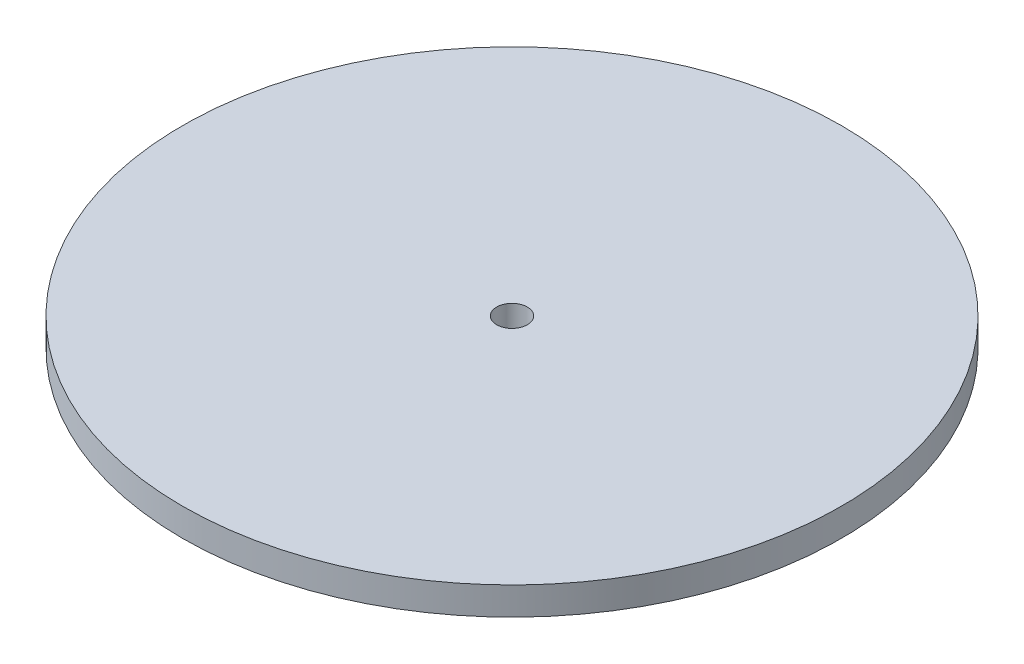
ISO-10303-21;
HEADER;
FILE_DESCRIPTION(('STEP AP214'),'2;1');
FILE_NAME('part.step','',(''),(''),'','','');
FILE_SCHEMA(('AUTOMOTIVE_DESIGN { 1 0 10303 214 1 1 1 1 }'));
ENDSEC;
DATA;
#1=APPLICATION_CONTEXT('core data for automotive mechanical design processes');
#2=APPLICATION_PROTOCOL_DEFINITION('international standard','automotive_design',2000,#1);
#3=PRODUCT_CONTEXT('',#1,'mechanical');
#4=PRODUCT('Part','Part','',(#3));
#5=PRODUCT_RELATED_PRODUCT_CATEGORY('part','',(#4));
#6=PRODUCT_DEFINITION_FORMATION('','',#4);
#7=PRODUCT_DEFINITION_CONTEXT('part definition',#1,'design');
#8=PRODUCT_DEFINITION('design','',#6,#7);
#9=PRODUCT_DEFINITION_SHAPE('','',#8);
#10=(LENGTH_UNIT() NAMED_UNIT(*) SI_UNIT(.MILLI.,.METRE.));
#11=(NAMED_UNIT(*) PLANE_ANGLE_UNIT() SI_UNIT($,.RADIAN.));
#12=(NAMED_UNIT(*) SI_UNIT($,.STERADIAN.) SOLID_ANGLE_UNIT());
#13=UNCERTAINTY_MEASURE_WITH_UNIT(LENGTH_MEASURE(1.E-05),#10,'distance_accuracy_value','');
#14=(GEOMETRIC_REPRESENTATION_CONTEXT(3) GLOBAL_UNCERTAINTY_ASSIGNED_CONTEXT((#13)) GLOBAL_UNIT_ASSIGNED_CONTEXT((#10,
#11,#12)) REPRESENTATION_CONTEXT('',''));
#15=CARTESIAN_POINT('',(0.,0.,0.));
#16=DIRECTION('',(0.,0.,1.));
#17=DIRECTION('',(1.,0.,0.));
#18=AXIS2_PLACEMENT_3D('',#15,#16,#17);
#19=CARTESIAN_POINT('',(0.,6.35,0.));
#20=DIRECTION('',(0.,-1.,0.));
#21=DIRECTION('',(0.,0.,-1.));
#22=AXIS2_PLACEMENT_3D('',#19,#20,#21);
#23=CYLINDRICAL_SURFACE('',#22,75.);
#24=CARTESIAN_POINT('',(0.,6.35,0.));
#25=DIRECTION('',(0.,1.,0.));
#26=DIRECTION('',(0.,0.,1.));
#27=AXIS2_PLACEMENT_3D('',#24,#25,#26);
#28=CIRCLE('',#27,75.);
#29=CARTESIAN_POINT('',(0.,6.35,75.));
#30=VERTEX_POINT('',#29);
#31=EDGE_CURVE('E10',#30,#30,#28,.T.);
#32=ORIENTED_EDGE('',*,*,#31,.F.);
#33=EDGE_LOOP('',(#32));
#34=FACE_BOUND('',#33,.T.);
#35=CARTESIAN_POINT('',(0.,0.,0.));
#36=DIRECTION('',(0.,1.,0.));
#37=DIRECTION('',(0.,0.,1.));
#38=AXIS2_PLACEMENT_3D('',#35,#36,#37);
#39=CIRCLE('',#38,75.);
#40=CARTESIAN_POINT('',(0.,0.,75.));
#41=VERTEX_POINT('',#40);
#42=EDGE_CURVE('E39',#41,#41,#39,.T.);
#43=ORIENTED_EDGE('',*,*,#42,.T.);
#44=EDGE_LOOP('',(#43));
#45=FACE_BOUND('',#44,.T.);
#46=ADVANCED_FACE('F36',(#34,#45),#23,.T.);
#47=CARTESIAN_POINT('',(0.,6.35,0.));
#48=DIRECTION('',(0.,1.,0.));
#49=DIRECTION('',(0.,0.,1.));
#50=AXIS2_PLACEMENT_3D('',#47,#48,#49);
#51=PLANE('',#50);
#52=CARTESIAN_POINT('',(0.,6.35,0.));
#53=DIRECTION('',(0.,1.,0.));
#54=DIRECTION('',(0.,0.,1.));
#55=AXIS2_PLACEMENT_3D('',#52,#53,#54);
#56=CIRCLE('',#55,3.5);
#57=CARTESIAN_POINT('',(0.,6.35,3.5));
#58=VERTEX_POINT('',#57);
#59=EDGE_CURVE('E50',#58,#58,#56,.T.);
#60=ORIENTED_EDGE('',*,*,#59,.F.);
#61=EDGE_LOOP('',(#60));
#62=FACE_BOUND('',#61,.T.);
#63=ORIENTED_EDGE('',*,*,#31,.T.);
#64=EDGE_LOOP('',(#63));
#65=FACE_BOUND('',#64,.T.);
#66=ADVANCED_FACE('F56',(#62,#65),#51,.T.);
#67=CARTESIAN_POINT('',(0.,0.,0.));
#68=DIRECTION('',(0.,1.,0.));
#69=DIRECTION('',(0.,0.,1.));
#70=AXIS2_PLACEMENT_3D('',#67,#68,#69);
#71=PLANE('',#70);
#72=CARTESIAN_POINT('',(0.,0.,0.));
#73=DIRECTION('',(0.,1.,0.));
#74=DIRECTION('',(0.,0.,1.));
#75=AXIS2_PLACEMENT_3D('',#72,#73,#74);
#76=CIRCLE('',#75,3.5);
#77=CARTESIAN_POINT('',(0.,0.,3.5));
#78=VERTEX_POINT('',#77);
#79=EDGE_CURVE('E46',#78,#78,#76,.F.);
#80=ORIENTED_EDGE('',*,*,#79,.F.);
#81=EDGE_LOOP('',(#80));
#82=FACE_BOUND('',#81,.T.);
#83=ORIENTED_EDGE('',*,*,#42,.F.);
#84=EDGE_LOOP('',(#83));
#85=FACE_BOUND('',#84,.T.);
#86=ADVANCED_FACE('F58',(#82,#85),#71,.F.);
#87=CARTESIAN_POINT('',(0.,-9.89949493661167,0.));
#88=DIRECTION('',(0.,1.,0.));
#89=DIRECTION('',(0.,0.,1.));
#90=AXIS2_PLACEMENT_3D('',#87,#88,#89);
#91=CYLINDRICAL_SURFACE('',#90,3.5);
#92=ORIENTED_EDGE('',*,*,#79,.T.);
#93=EDGE_LOOP('',(#92));
#94=FACE_BOUND('',#93,.T.);
#95=ORIENTED_EDGE('',*,*,#59,.T.);
#96=EDGE_LOOP('',(#95));
#97=FACE_BOUND('',#96,.T.);
#98=ADVANCED_FACE('F54',(#94,#97),#91,.F.);
#99=CLOSED_SHELL('',(#46,#66,#86,#98));
#100=MANIFOLD_SOLID_BREP('B2',#99);
#101=ADVANCED_BREP_SHAPE_REPRESENTATION('',(#18,#100),#14);
#102=SHAPE_DEFINITION_REPRESENTATION(#9,#101);
ENDSEC;
END-ISO-10303-21;
